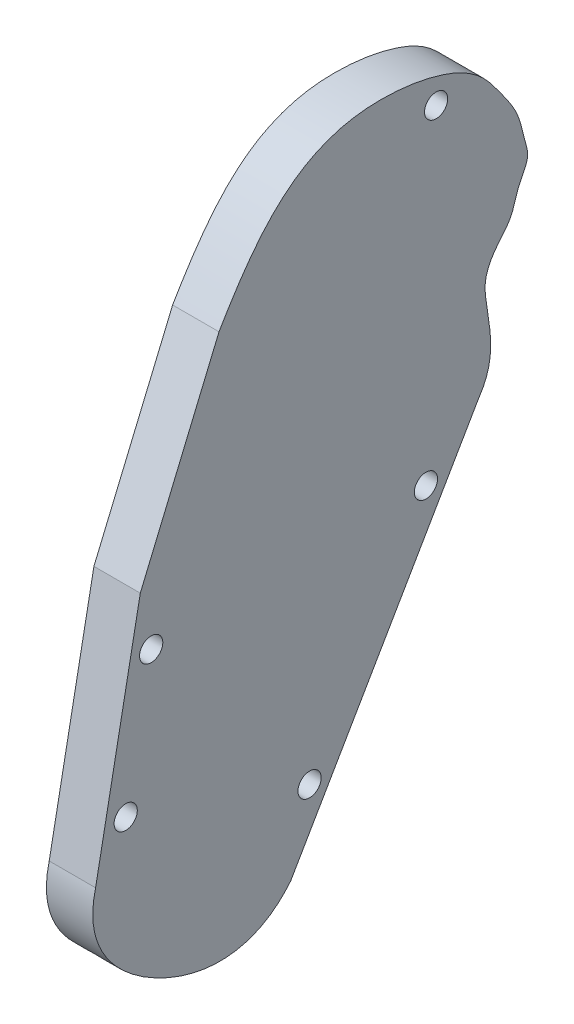
ISO-10303-21;
HEADER;
FILE_DESCRIPTION(('STEP AP214'),'2;1');
FILE_NAME('part.step','',(''),(''),'','','');
FILE_SCHEMA(('AUTOMOTIVE_DESIGN { 1 0 10303 214 1 1 1 1 }'));
ENDSEC;
DATA;
#1=APPLICATION_CONTEXT('core data for automotive mechanical design processes');
#2=APPLICATION_PROTOCOL_DEFINITION('international standard','automotive_design',2000,#1);
#3=PRODUCT_CONTEXT('',#1,'mechanical');
#4=PRODUCT('Part','Part','',(#3));
#5=PRODUCT_RELATED_PRODUCT_CATEGORY('part','',(#4));
#6=PRODUCT_DEFINITION_FORMATION('','',#4);
#7=PRODUCT_DEFINITION_CONTEXT('part definition',#1,'design');
#8=PRODUCT_DEFINITION('design','',#6,#7);
#9=PRODUCT_DEFINITION_SHAPE('','',#8);
#10=(LENGTH_UNIT() NAMED_UNIT(*) SI_UNIT(.MILLI.,.METRE.));
#11=(NAMED_UNIT(*) PLANE_ANGLE_UNIT() SI_UNIT($,.RADIAN.));
#12=(NAMED_UNIT(*) SI_UNIT($,.STERADIAN.) SOLID_ANGLE_UNIT());
#13=UNCERTAINTY_MEASURE_WITH_UNIT(LENGTH_MEASURE(1.E-05),#10,'distance_accuracy_value','');
#14=(GEOMETRIC_REPRESENTATION_CONTEXT(3) GLOBAL_UNCERTAINTY_ASSIGNED_CONTEXT((#13)) GLOBAL_UNIT_ASSIGNED_CONTEXT((#10,
#11,#12)) REPRESENTATION_CONTEXT('',''));
#15=CARTESIAN_POINT('',(0.,0.,0.));
#16=DIRECTION('',(0.,0.,1.));
#17=DIRECTION('',(1.,0.,0.));
#18=AXIS2_PLACEMENT_3D('',#15,#16,#17);
#19=CARTESIAN_POINT('',(-5.,3.24268600938084,-18.5764900303567));
#20=CARTESIAN_POINT('',(-5.,5.87147233760619,-20.3998753405111));
#21=CARTESIAN_POINT('',(-5.,9.3921691085198,-19.6866785835696));
#22=CARTESIAN_POINT('',(-5.,13.8192568790985,-19.0567329112693));
#23=CARTESIAN_POINT('',(-5.,16.2846985090689,-20.2071283244041));
#24=CARTESIAN_POINT('',(-5.,18.154123407449,-22.236157968365));
#25=CARTESIAN_POINT('',(-5.,20.9000774768321,-22.6647365482831));
#26=CARTESIAN_POINT('',(-5.,22.8746123278666,-24.1423851355693));
#27=CARTESIAN_POINT('',(-5.,25.1104176667717,-23.3711660386291));
#28=CARTESIAN_POINT('',(-5.,27.7566189817592,-22.923217745328));
#29=CARTESIAN_POINT('',(-5.,30.3603766268074,-21.0204509876353));
#30=CARTESIAN_POINT('',(-5.,33.0146527615162,-19.1114742427048));
#31=CARTESIAN_POINT('',(-5.,34.5537711996612,-16.8206103843109));
#32=CARTESIAN_POINT('',(-5.,35.7835159213308,-13.5726265314443));
#33=CARTESIAN_POINT('',(-5.,36.5144876853185,-9.24139966209001));
#34=CARTESIAN_POINT('',(-5.,36.2299152608115,-4.11269981578682));
#35=CARTESIAN_POINT('',(-5.,33.0862653845341,3.47885982254407));
#36=CARTESIAN_POINT('',(-5.,27.3181439560148,7.11739920299947));
#37=CARTESIAN_POINT('',(-5.,23.3959085428148,9.43898597361147));
#38=B_SPLINE_CURVE_WITH_KNOTS('',3,(#19,#20,#21,#22,#23,#24,#25,#26,#27,#28,#29,#30,#31,#32,#33,
#34,#35,#36,#37),.UNSPECIFIED.,.F.,.F.,(4,1,1,1,1,1,1,1,1,1,1,1,1,1,1,1,4),(0.,
0.124663564460705,0.161437725204497,0.195659694225229,0.24195670233481,0.280314530276236,
0.317452049066172,0.342380682780381,0.380427051216662,0.438288460536179,0.482854303333472,
0.526779389798994,0.55920608913252,0.638222424046053,0.72183705193685,0.785951737587909,1.),.UNSPECIFIED.);
#39=DIRECTION('',(1.,0.,0.));
#40=VECTOR('',#39,1.);
#41=SURFACE_OF_LINEAR_EXTRUSION('',#38,#40);
#42=CARTESIAN_POINT('',(0.,3.24268600938084,-18.5764900303567));
#43=CARTESIAN_POINT('',(0.,5.87147233760619,-20.3998753405111));
#44=CARTESIAN_POINT('',(0.,9.3921691085198,-19.6866785835696));
#45=CARTESIAN_POINT('',(0.,13.8192568790985,-19.0567329112693));
#46=CARTESIAN_POINT('',(0.,16.2846985090689,-20.2071283244041));
#47=CARTESIAN_POINT('',(0.,18.154123407449,-22.236157968365));
#48=CARTESIAN_POINT('',(0.,20.9000774768321,-22.6647365482831));
#49=CARTESIAN_POINT('',(0.,22.8746123278666,-24.1423851355693));
#50=CARTESIAN_POINT('',(0.,25.1104176667717,-23.3711660386291));
#51=CARTESIAN_POINT('',(0.,27.7566189817592,-22.923217745328));
#52=CARTESIAN_POINT('',(0.,30.3603766268074,-21.0204509876353));
#53=CARTESIAN_POINT('',(0.,33.0146527615162,-19.1114742427048));
#54=CARTESIAN_POINT('',(0.,34.5537711996612,-16.8206103843109));
#55=CARTESIAN_POINT('',(0.,35.7835159213308,-13.5726265314443));
#56=CARTESIAN_POINT('',(0.,36.5144876853185,-9.24139966209001));
#57=CARTESIAN_POINT('',(0.,36.2299152608115,-4.11269981578682));
#58=CARTESIAN_POINT('',(0.,33.0862653845341,3.47885982254407));
#59=CARTESIAN_POINT('',(0.,27.3181439560148,7.11739920299947));
#60=CARTESIAN_POINT('',(0.,23.3959085428148,9.43898597361147));
#61=B_SPLINE_CURVE_WITH_KNOTS('',3,(#42,#43,#44,#45,#46,#47,#48,#49,#50,#51,#52,#53,#54,#55,#56,
#57,#58,#59,#60),.UNSPECIFIED.,.F.,.F.,(4,1,1,1,1,1,1,1,1,1,1,1,1,1,1,1,4),(0.,
0.124663564460705,0.161437725204497,0.195659694225229,0.24195670233481,0.280314530276236,
0.317452049066172,0.342380682780381,0.380427051216662,0.438288460536179,0.482854303333472,
0.526779389798994,0.55920608913252,0.638222424046053,0.72183705193685,0.785951737587909,1.),.UNSPECIFIED.);
#62=CARTESIAN_POINT('',(0.,3.24268600938084,-18.5764900303567));
#63=VERTEX_POINT('',#62);
#64=CARTESIAN_POINT('',(0.,23.3959085428148,9.43898597361147));
#65=VERTEX_POINT('',#64);
#66=EDGE_CURVE('E143',#63,#65,#61,.T.);
#67=ORIENTED_EDGE('',*,*,#66,.F.);
#68=DIRECTION('',(1.,0.,0.));
#69=VECTOR('',#68,1.);
#70=CARTESIAN_POINT('',(-5.,3.24268600938084,-18.5764900303567));
#71=LINE('',#70,#69);
#72=CARTESIAN_POINT('',(-5.,3.24268600938084,-18.5764900303567));
#73=VERTEX_POINT('',#72);
#74=EDGE_CURVE('E11',#73,#63,#71,.T.);
#75=ORIENTED_EDGE('',*,*,#74,.F.);
#76=CARTESIAN_POINT('',(-5.,23.3959085428148,9.43898597361147));
#77=VERTEX_POINT('',#76);
#78=EDGE_CURVE('E112',#73,#77,#38,.T.);
#79=ORIENTED_EDGE('',*,*,#78,.T.);
#80=DIRECTION('',(1.,0.,0.));
#81=VECTOR('',#80,1.);
#82=CARTESIAN_POINT('',(-5.,23.3959085428148,9.43898597361147));
#83=LINE('',#82,#81);
#84=EDGE_CURVE('E86',#77,#65,#83,.T.);
#85=ORIENTED_EDGE('',*,*,#84,.T.);
#86=EDGE_LOOP('',(#67,#75,#79,#85));
#87=FACE_BOUND('',#86,.T.);
#88=ADVANCED_FACE('F38',(#87),#41,.T.);
#89=CARTESIAN_POINT('',(-5.,3.24268600938084,-18.5764900303567));
#90=DIRECTION('',(0.,-0.501767837348837,-0.86500233375539));
#91=DIRECTION('',(0.,0.86500233375539,-0.501767837348837));
#92=AXIS2_PLACEMENT_3D('',#89,#90,#91);
#93=PLANE('',#92);
#94=DIRECTION('',(0.,0.86500233375539,-0.501767837348837));
#95=VECTOR('',#94,1.);
#96=CARTESIAN_POINT('',(0.,3.24268600938084,-18.5764900303567));
#97=LINE('',#96,#95);
#98=CARTESIAN_POINT('',(0.,-31.739081671424,1.71562391069139));
#99=VERTEX_POINT('',#98);
#100=EDGE_CURVE('E149',#99,#63,#97,.T.);
#101=ORIENTED_EDGE('',*,*,#100,.F.);
#102=DIRECTION('',(1.,0.,0.));
#103=VECTOR('',#102,1.);
#104=CARTESIAN_POINT('',(-5.,-31.739081671424,1.71562391069139));
#105=LINE('',#104,#103);
#106=CARTESIAN_POINT('',(-5.,-31.739081671424,1.71562391069139));
#107=VERTEX_POINT('',#106);
#108=EDGE_CURVE('E48',#107,#99,#105,.T.);
#109=ORIENTED_EDGE('',*,*,#108,.F.);
#110=DIRECTION('',(0.,0.86500233375539,-0.501767837348837));
#111=VECTOR('',#110,1.);
#112=CARTESIAN_POINT('',(-5.,3.24268600938084,-18.5764900303567));
#113=LINE('',#112,#111);
#114=EDGE_CURVE('E107',#107,#73,#113,.T.);
#115=ORIENTED_EDGE('',*,*,#114,.T.);
#116=ORIENTED_EDGE('',*,*,#74,.T.);
#117=EDGE_LOOP('',(#101,#109,#115,#116));
#118=FACE_BOUND('',#117,.T.);
#119=ADVANCED_FACE('F126',(#118),#93,.T.);
#120=CARTESIAN_POINT('',(-5.,-21.856113647564,22.7429604930037));
#121=CARTESIAN_POINT('',(-5.,-27.3028345119861,24.1423851355693));
#122=CARTESIAN_POINT('',(-5.,-35.6646516834791,16.6039483783817));
#123=CARTESIAN_POINT('',(-5.,-36.5144876853185,5.5980948755147));
#124=CARTESIAN_POINT('',(-5.,-31.739081671424,1.71562391069139));
#125=B_SPLINE_CURVE_WITH_KNOTS('',3,(#120,#121,#122,#123,#124),.UNSPECIFIED.,.F.,.F.,(4,1,4),
(0.,0.48418997005999,1.),.UNSPECIFIED.);
#126=DIRECTION('',(1.,0.,0.));
#127=VECTOR('',#126,1.);
#128=SURFACE_OF_LINEAR_EXTRUSION('',#125,#127);
#129=CARTESIAN_POINT('',(0.,-21.856113647564,22.7429604930037));
#130=CARTESIAN_POINT('',(0.,-27.3028345119861,24.1423851355693));
#131=CARTESIAN_POINT('',(0.,-35.6646516834791,16.6039483783817));
#132=CARTESIAN_POINT('',(0.,-36.5144876853185,5.5980948755147));
#133=CARTESIAN_POINT('',(0.,-31.739081671424,1.71562391069139));
#134=B_SPLINE_CURVE_WITH_KNOTS('',3,(#129,#130,#131,#132,#133),.UNSPECIFIED.,.F.,.F.,(4,1,4),
(0.,0.48418997005999,1.),.UNSPECIFIED.);
#135=CARTESIAN_POINT('',(0.,-21.856113647564,22.7429604930037));
#136=VERTEX_POINT('',#135);
#137=EDGE_CURVE('E96',#136,#99,#134,.T.);
#138=ORIENTED_EDGE('',*,*,#137,.F.);
#139=DIRECTION('',(1.,0.,0.));
#140=VECTOR('',#139,1.);
#141=CARTESIAN_POINT('',(-5.,-21.856113647564,22.7429604930037));
#142=LINE('',#141,#140);
#143=CARTESIAN_POINT('',(-5.,-21.856113647564,22.7429604930037));
#144=VERTEX_POINT('',#143);
#145=EDGE_CURVE('E91',#144,#136,#142,.T.);
#146=ORIENTED_EDGE('',*,*,#145,.F.);
#147=EDGE_CURVE('E94',#144,#107,#125,.T.);
#148=ORIENTED_EDGE('',*,*,#147,.T.);
#149=ORIENTED_EDGE('',*,*,#108,.T.);
#150=EDGE_LOOP('',(#138,#146,#148,#149));
#151=FACE_BOUND('',#150,.T.);
#152=ADVANCED_FACE('F93',(#151),#128,.T.);
#153=CARTESIAN_POINT('',(-5.,-21.856113647564,22.7429604930037));
#154=DIRECTION('',(0.,0.188598031806165,0.982054368351794));
#155=DIRECTION('',(0.,-0.982054368351794,0.188598031806165));
#156=AXIS2_PLACEMENT_3D('',#153,#154,#155);
#157=PLANE('',#156);
#158=DIRECTION('',(0.,-0.982054368351794,0.188598031806165));
#159=VECTOR('',#158,1.);
#160=CARTESIAN_POINT('',(0.,-21.856113647564,22.7429604930037));
#161=LINE('',#160,#159);
#162=CARTESIAN_POINT('',(0.,3.24268600938089,17.9228768310965));
#163=VERTEX_POINT('',#162);
#164=EDGE_CURVE('E151',#163,#136,#161,.T.);
#165=ORIENTED_EDGE('',*,*,#164,.F.);
#166=DIRECTION('',(1.,0.,0.));
#167=VECTOR('',#166,1.);
#168=CARTESIAN_POINT('',(-5.,3.24268600938089,17.9228768310965));
#169=LINE('',#168,#167);
#170=CARTESIAN_POINT('',(-5.,3.24268600938089,17.9228768310965));
#171=VERTEX_POINT('',#170);
#172=EDGE_CURVE('E101',#171,#163,#169,.T.);
#173=ORIENTED_EDGE('',*,*,#172,.F.);
#174=DIRECTION('',(0.,-0.982054368351794,0.188598031806165));
#175=VECTOR('',#174,1.);
#176=CARTESIAN_POINT('',(-5.,-21.856113647564,22.7429604930037));
#177=LINE('',#176,#175);
#178=EDGE_CURVE('E106',#171,#144,#177,.T.);
#179=ORIENTED_EDGE('',*,*,#178,.T.);
#180=ORIENTED_EDGE('',*,*,#145,.T.);
#181=EDGE_LOOP('',(#165,#173,#179,#180));
#182=FACE_BOUND('',#181,.T.);
#183=ADVANCED_FACE('F109',(#182),#157,.T.);
#184=CARTESIAN_POINT('',(-5.,3.24268600938089,17.9228768310965));
#185=DIRECTION('',(0.,0.387991872870305,0.921662794402917));
#186=DIRECTION('',(0.,-0.921662794402917,0.387991872870305));
#187=AXIS2_PLACEMENT_3D('',#184,#185,#186);
#188=PLANE('',#187);
#189=DIRECTION('',(0.,-0.921662794402917,0.387991872870305));
#190=VECTOR('',#189,1.);
#191=CARTESIAN_POINT('',(0.,3.24268600938089,17.9228768310965));
#192=LINE('',#191,#190);
#193=EDGE_CURVE('E147',#65,#163,#192,.T.);
#194=ORIENTED_EDGE('',*,*,#193,.F.);
#195=ORIENTED_EDGE('',*,*,#84,.F.);
#196=DIRECTION('',(0.,-0.921662794402917,0.387991872870305));
#197=VECTOR('',#196,1.);
#198=CARTESIAN_POINT('',(-5.,3.24268600938089,17.9228768310965));
#199=LINE('',#198,#197);
#200=EDGE_CURVE('E110',#77,#171,#199,.T.);
#201=ORIENTED_EDGE('',*,*,#200,.T.);
#202=ORIENTED_EDGE('',*,*,#172,.T.);
#203=EDGE_LOOP('',(#194,#195,#201,#202));
#204=FACE_BOUND('',#203,.T.);
#205=ADVANCED_FACE('F129',(#204),#188,.T.);
#206=CARTESIAN_POINT('',(-5.,33.6435818831973,-18.0927204875211));
#207=DIRECTION('',(-1.,0.,0.));
#208=DIRECTION('',(0.,0.,1.));
#209=AXIS2_PLACEMENT_3D('',#206,#207,#208);
#210=PLANE('',#209);
#211=CARTESIAN_POINT('',(-5.,32.8295709845023,-13.9632215639872));
#212=DIRECTION('',(-1.,0.,0.));
#213=DIRECTION('',(0.,0.,1.));
#214=AXIS2_PLACEMENT_3D('',#211,#212,#213);
#215=CIRCLE('',#214,1.25);
#216=CARTESIAN_POINT('',(-5.,32.8295709845023,-12.7132215639872));
#217=VERTEX_POINT('',#216);
#218=EDGE_CURVE('E148',#217,#217,#215,.T.);
#219=ORIENTED_EDGE('',*,*,#218,.F.);
#220=EDGE_LOOP('',(#219));
#221=FACE_BOUND('',#220,.T.);
#222=CARTESIAN_POINT('',(-5.,-2.11585385974969,-12.8669759992907));
#223=DIRECTION('',(-1.,0.,0.));
#224=DIRECTION('',(0.,0.,1.));
#225=AXIS2_PLACEMENT_3D('',#222,#223,#224);
#226=CIRCLE('',#225,1.25);
#227=CARTESIAN_POINT('',(-5.,-2.11585385974969,-11.6169759992907));
#228=VERTEX_POINT('',#227);
#229=EDGE_CURVE('E173',#228,#228,#226,.T.);
#230=ORIENTED_EDGE('',*,*,#229,.F.);
#231=EDGE_LOOP('',(#230));
#232=FACE_BOUND('',#231,.T.);
#233=CARTESIAN_POINT('',(-5.,-23.7409122036345,-0.322780065569843));
#234=DIRECTION('',(-1.,0.,0.));
#235=DIRECTION('',(0.,0.,1.));
#236=AXIS2_PLACEMENT_3D('',#233,#234,#235);
#237=CIRCLE('',#236,1.25);
#238=CARTESIAN_POINT('',(-5.,-23.7409122036345,0.927219934430157));
#239=VERTEX_POINT('',#238);
#240=EDGE_CURVE('E170',#239,#239,#237,.T.);
#241=ORIENTED_EDGE('',*,*,#240,.F.);
#242=EDGE_LOOP('',(#241));
#243=FACE_BOUND('',#242,.T.);
#244=CARTESIAN_POINT('',(-5.,-16.879160193193,19.4960489892783));
#245=DIRECTION('',(-1.,0.,0.));
#246=DIRECTION('',(0.,0.,1.));
#247=AXIS2_PLACEMENT_3D('',#244,#245,#246);
#248=CIRCLE('',#247,1.25);
#249=CARTESIAN_POINT('',(-5.,-16.879160193193,20.7460489892783));
#250=VERTEX_POINT('',#249);
#251=EDGE_CURVE('E167',#250,#250,#248,.T.);
#252=ORIENTED_EDGE('',*,*,#251,.F.);
#253=EDGE_LOOP('',(#252));
#254=FACE_BOUND('',#253,.T.);
#255=CARTESIAN_POINT('',(-5.,-2.58295858811781,16.750543677239));
#256=DIRECTION('',(-1.,0.,0.));
#257=DIRECTION('',(0.,0.,1.));
#258=AXIS2_PLACEMENT_3D('',#255,#256,#257);
#259=CIRCLE('',#258,1.25);
#260=CARTESIAN_POINT('',(-5.,-2.58295858811781,18.000543677239));
#261=VERTEX_POINT('',#260);
#262=EDGE_CURVE('E163',#261,#261,#259,.T.);
#263=ORIENTED_EDGE('',*,*,#262,.F.);
#264=EDGE_LOOP('',(#263));
#265=FACE_BOUND('',#264,.T.);
#266=ORIENTED_EDGE('',*,*,#78,.F.);
#267=ORIENTED_EDGE('',*,*,#114,.F.);
#268=ORIENTED_EDGE('',*,*,#147,.F.);
#269=ORIENTED_EDGE('',*,*,#178,.F.);
#270=ORIENTED_EDGE('',*,*,#200,.F.);
#271=EDGE_LOOP('',(#266,#267,#268,#269,#270));
#272=FACE_BOUND('',#271,.T.);
#273=ADVANCED_FACE('F105',(#221,#232,#243,#254,#265,#272),#210,.T.);
#274=CARTESIAN_POINT('',(0.,33.6435818831973,-18.0927204875211));
#275=DIRECTION('',(-1.,0.,0.));
#276=DIRECTION('',(0.,0.,1.));
#277=AXIS2_PLACEMENT_3D('',#274,#275,#276);
#278=PLANE('',#277);
#279=CARTESIAN_POINT('',(0.,32.8295709845023,-13.9632215639872));
#280=DIRECTION('',(-1.,0.,0.));
#281=DIRECTION('',(0.,0.,1.));
#282=AXIS2_PLACEMENT_3D('',#279,#280,#281);
#283=CIRCLE('',#282,1.25);
#284=CARTESIAN_POINT('',(0.,32.8295709845023,-12.7132215639872));
#285=VERTEX_POINT('',#284);
#286=EDGE_CURVE('E42',#285,#285,#283,.T.);
#287=ORIENTED_EDGE('',*,*,#286,.T.);
#288=EDGE_LOOP('',(#287));
#289=FACE_BOUND('',#288,.T.);
#290=CARTESIAN_POINT('',(0.,-2.11585385974969,-12.8669759992907));
#291=DIRECTION('',(-1.,0.,0.));
#292=DIRECTION('',(0.,0.,1.));
#293=AXIS2_PLACEMENT_3D('',#290,#291,#292);
#294=CIRCLE('',#293,1.25);
#295=CARTESIAN_POINT('',(0.,-2.11585385974969,-11.6169759992907));
#296=VERTEX_POINT('',#295);
#297=EDGE_CURVE('E171',#296,#296,#294,.T.);
#298=ORIENTED_EDGE('',*,*,#297,.T.);
#299=EDGE_LOOP('',(#298));
#300=FACE_BOUND('',#299,.T.);
#301=CARTESIAN_POINT('',(0.,-23.7409122036345,-0.322780065569843));
#302=DIRECTION('',(-1.,0.,0.));
#303=DIRECTION('',(0.,0.,1.));
#304=AXIS2_PLACEMENT_3D('',#301,#302,#303);
#305=CIRCLE('',#304,1.25);
#306=CARTESIAN_POINT('',(0.,-23.7409122036345,0.927219934430157));
#307=VERTEX_POINT('',#306);
#308=EDGE_CURVE('E168',#307,#307,#305,.T.);
#309=ORIENTED_EDGE('',*,*,#308,.T.);
#310=EDGE_LOOP('',(#309));
#311=FACE_BOUND('',#310,.T.);
#312=CARTESIAN_POINT('',(0.,-16.879160193193,19.4960489892783));
#313=DIRECTION('',(-1.,0.,0.));
#314=DIRECTION('',(0.,0.,1.));
#315=AXIS2_PLACEMENT_3D('',#312,#313,#314);
#316=CIRCLE('',#315,1.25);
#317=CARTESIAN_POINT('',(0.,-16.879160193193,20.7460489892783));
#318=VERTEX_POINT('',#317);
#319=EDGE_CURVE('E164',#318,#318,#316,.T.);
#320=ORIENTED_EDGE('',*,*,#319,.T.);
#321=EDGE_LOOP('',(#320));
#322=FACE_BOUND('',#321,.T.);
#323=CARTESIAN_POINT('',(0.,-2.58295858811781,16.750543677239));
#324=DIRECTION('',(-1.,0.,0.));
#325=DIRECTION('',(0.,0.,1.));
#326=AXIS2_PLACEMENT_3D('',#323,#324,#325);
#327=CIRCLE('',#326,1.25);
#328=CARTESIAN_POINT('',(0.,-2.58295858811781,18.000543677239));
#329=VERTEX_POINT('',#328);
#330=EDGE_CURVE('E160',#329,#329,#327,.T.);
#331=ORIENTED_EDGE('',*,*,#330,.T.);
#332=EDGE_LOOP('',(#331));
#333=FACE_BOUND('',#332,.T.);
#334=ORIENTED_EDGE('',*,*,#66,.T.);
#335=ORIENTED_EDGE('',*,*,#193,.T.);
#336=ORIENTED_EDGE('',*,*,#164,.T.);
#337=ORIENTED_EDGE('',*,*,#137,.T.);
#338=ORIENTED_EDGE('',*,*,#100,.T.);
#339=EDGE_LOOP('',(#334,#335,#336,#337,#338));
#340=FACE_BOUND('',#339,.T.);
#341=ADVANCED_FACE('F135',(#289,#300,#311,#322,#333,#340),#278,.F.);
#342=CARTESIAN_POINT('',(-47.0000000000001,-2.58295858811781,16.750543677239));
#343=DIRECTION('',(1.,0.,0.));
#344=DIRECTION('',(0.,0.,-1.));
#345=AXIS2_PLACEMENT_3D('',#342,#343,#344);
#346=CYLINDRICAL_SURFACE('',#345,1.25);
#347=ORIENTED_EDGE('',*,*,#262,.T.);
#348=EDGE_LOOP('',(#347));
#349=FACE_BOUND('',#348,.T.);
#350=ORIENTED_EDGE('',*,*,#330,.F.);
#351=EDGE_LOOP('',(#350));
#352=FACE_BOUND('',#351,.T.);
#353=ADVANCED_FACE('F210',(#349,#352),#346,.F.);
#354=CARTESIAN_POINT('',(-47.0000000000001,-16.879160193193,19.4960489892783));
#355=DIRECTION('',(1.,0.,0.));
#356=DIRECTION('',(0.,0.,-1.));
#357=AXIS2_PLACEMENT_3D('',#354,#355,#356);
#358=CYLINDRICAL_SURFACE('',#357,1.25);
#359=ORIENTED_EDGE('',*,*,#251,.T.);
#360=EDGE_LOOP('',(#359));
#361=FACE_BOUND('',#360,.T.);
#362=ORIENTED_EDGE('',*,*,#319,.F.);
#363=EDGE_LOOP('',(#362));
#364=FACE_BOUND('',#363,.T.);
#365=ADVANCED_FACE('F212',(#361,#364),#358,.F.);
#366=CARTESIAN_POINT('',(-47.0000000000001,-23.7409122036345,-0.322780065569843));
#367=DIRECTION('',(1.,0.,0.));
#368=DIRECTION('',(0.,0.,-1.));
#369=AXIS2_PLACEMENT_3D('',#366,#367,#368);
#370=CYLINDRICAL_SURFACE('',#369,1.25);
#371=ORIENTED_EDGE('',*,*,#240,.T.);
#372=EDGE_LOOP('',(#371));
#373=FACE_BOUND('',#372,.T.);
#374=ORIENTED_EDGE('',*,*,#308,.F.);
#375=EDGE_LOOP('',(#374));
#376=FACE_BOUND('',#375,.T.);
#377=ADVANCED_FACE('F205',(#373,#376),#370,.F.);
#378=CARTESIAN_POINT('',(-47.0000000000001,-2.11585385974969,-12.8669759992907));
#379=DIRECTION('',(1.,0.,0.));
#380=DIRECTION('',(0.,0.,-1.));
#381=AXIS2_PLACEMENT_3D('',#378,#379,#380);
#382=CYLINDRICAL_SURFACE('',#381,1.25);
#383=ORIENTED_EDGE('',*,*,#229,.T.);
#384=EDGE_LOOP('',(#383));
#385=FACE_BOUND('',#384,.T.);
#386=ORIENTED_EDGE('',*,*,#297,.F.);
#387=EDGE_LOOP('',(#386));
#388=FACE_BOUND('',#387,.T.);
#389=ADVANCED_FACE('F200',(#385,#388),#382,.F.);
#390=CARTESIAN_POINT('',(-47.0000000000001,32.8295709845023,-13.9632215639872));
#391=DIRECTION('',(1.,0.,0.));
#392=DIRECTION('',(0.,0.,-1.));
#393=AXIS2_PLACEMENT_3D('',#390,#391,#392);
#394=CYLINDRICAL_SURFACE('',#393,1.25);
#395=ORIENTED_EDGE('',*,*,#218,.T.);
#396=EDGE_LOOP('',(#395));
#397=FACE_BOUND('',#396,.T.);
#398=ORIENTED_EDGE('',*,*,#286,.F.);
#399=EDGE_LOOP('',(#398));
#400=FACE_BOUND('',#399,.T.);
#401=ADVANCED_FACE('F198',(#397,#400),#394,.F.);
#402=CLOSED_SHELL('',(#88,#119,#152,#183,#205,#273,#341,#353,#365,#377,#389,#401));
#403=MANIFOLD_SOLID_BREP('B2',#402);
#404=ADVANCED_BREP_SHAPE_REPRESENTATION('',(#18,#403),#14);
#405=SHAPE_DEFINITION_REPRESENTATION(#9,#404);
ENDSEC;
END-ISO-10303-21;
